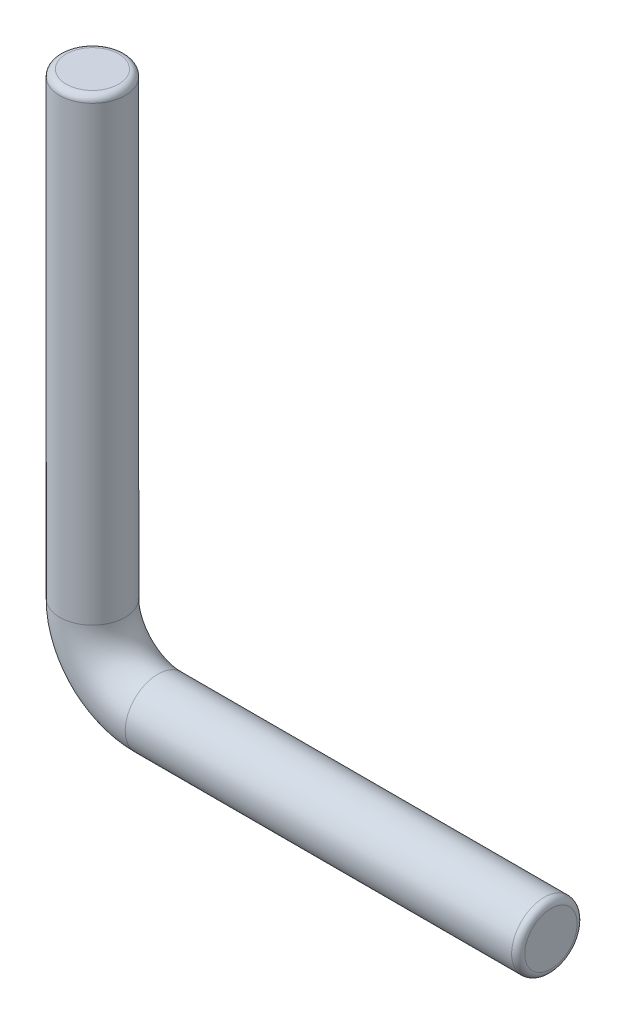
ISO-10303-21;
HEADER;
FILE_DESCRIPTION(('STEP AP214'),'2;1');
FILE_NAME('part.step','',(''),(''),'','','');
FILE_SCHEMA(('AUTOMOTIVE_DESIGN { 1 0 10303 214 1 1 1 1 }'));
ENDSEC;
DATA;
#1=APPLICATION_CONTEXT('core data for automotive mechanical design processes');
#2=APPLICATION_PROTOCOL_DEFINITION('international standard','automotive_design',2000,#1);
#3=PRODUCT_CONTEXT('',#1,'mechanical');
#4=PRODUCT('Part','Part','',(#3));
#5=PRODUCT_RELATED_PRODUCT_CATEGORY('part','',(#4));
#6=PRODUCT_DEFINITION_FORMATION('','',#4);
#7=PRODUCT_DEFINITION_CONTEXT('part definition',#1,'design');
#8=PRODUCT_DEFINITION('design','',#6,#7);
#9=PRODUCT_DEFINITION_SHAPE('','',#8);
#10=(LENGTH_UNIT() NAMED_UNIT(*) SI_UNIT(.MILLI.,.METRE.));
#11=(NAMED_UNIT(*) PLANE_ANGLE_UNIT() SI_UNIT($,.RADIAN.));
#12=(NAMED_UNIT(*) SI_UNIT($,.STERADIAN.) SOLID_ANGLE_UNIT());
#13=UNCERTAINTY_MEASURE_WITH_UNIT(LENGTH_MEASURE(1.E-05),#10,'distance_accuracy_value','');
#14=(GEOMETRIC_REPRESENTATION_CONTEXT(3) GLOBAL_UNCERTAINTY_ASSIGNED_CONTEXT((#13)) GLOBAL_UNIT_ASSIGNED_CONTEXT((#10,
#11,#12)) REPRESENTATION_CONTEXT('',''));
#15=CARTESIAN_POINT('',(0.,0.,0.));
#16=DIRECTION('',(0.,0.,1.));
#17=DIRECTION('',(1.,0.,0.));
#18=AXIS2_PLACEMENT_3D('',#15,#16,#17);
#19=CARTESIAN_POINT('',(70.,0.,0.));
#20=DIRECTION('',(1.,0.,0.));
#21=DIRECTION('',(0.,0.,-1.));
#22=AXIS2_PLACEMENT_3D('',#19,#20,#21);
#23=PLANE('',#22);
#24=CARTESIAN_POINT('',(70.,0.,0.));
#25=DIRECTION('',(1.,0.,0.));
#26=DIRECTION('',(0.,0.,-1.));
#27=AXIS2_PLACEMENT_3D('',#24,#25,#26);
#28=CIRCLE('',#27,4.);
#29=CARTESIAN_POINT('',(70.,0.,-4.));
#30=VERTEX_POINT('',#29);
#31=EDGE_CURVE('E62',#30,#30,#28,.T.);
#32=ORIENTED_EDGE('',*,*,#31,.T.);
#33=EDGE_LOOP('',(#32));
#34=FACE_BOUND('',#33,.T.);
#35=ADVANCED_FACE('F47',(#34),#23,.T.);
#36=CARTESIAN_POINT('',(0.,80.,0.));
#37=DIRECTION('',(0.,-1.,0.));
#38=DIRECTION('',(0.,0.,-1.));
#39=AXIS2_PLACEMENT_3D('',#36,#37,#38);
#40=PLANE('',#39);
#41=CARTESIAN_POINT('',(0.,80.,0.));
#42=DIRECTION('',(0.,-1.,0.));
#43=DIRECTION('',(0.,0.,-1.));
#44=AXIS2_PLACEMENT_3D('',#41,#42,#43);
#45=CIRCLE('',#44,4.);
#46=CARTESIAN_POINT('',(0.,80.,-4.));
#47=VERTEX_POINT('',#46);
#48=EDGE_CURVE('E11',#47,#47,#45,.F.);
#49=ORIENTED_EDGE('',*,*,#48,.T.);
#50=EDGE_LOOP('',(#49));
#51=FACE_BOUND('',#50,.T.);
#52=ADVANCED_FACE('F87',(#51),#40,.F.);
#53=CARTESIAN_POINT('',(70.,0.,0.));
#54=DIRECTION('',(-1.,0.,0.));
#55=DIRECTION('',(0.,0.,1.));
#56=AXIS2_PLACEMENT_3D('',#53,#54,#55);
#57=CYLINDRICAL_SURFACE('',#56,5.);
#58=CARTESIAN_POINT('',(69.,0.,0.));
#59=DIRECTION('',(1.,0.,0.));
#60=DIRECTION('',(0.,0.,-1.));
#61=AXIS2_PLACEMENT_3D('',#58,#59,#60);
#62=CIRCLE('',#61,5.);
#63=CARTESIAN_POINT('',(69.,0.,-5.));
#64=VERTEX_POINT('',#63);
#65=EDGE_CURVE('E58',#64,#64,#62,.F.);
#66=ORIENTED_EDGE('',*,*,#65,.T.);
#67=EDGE_LOOP('',(#66));
#68=FACE_BOUND('',#67,.T.);
#69=CARTESIAN_POINT('',(10.0000000000001,0.,0.));
#70=DIRECTION('',(1.,0.,0.));
#71=DIRECTION('',(0.,0.,-1.));
#72=AXIS2_PLACEMENT_3D('',#69,#70,#71);
#73=CIRCLE('',#72,5.);
#74=CARTESIAN_POINT('',(10.0000000000001,-5.,0.));
#75=VERTEX_POINT('',#74);
#76=EDGE_CURVE('E70',#75,#75,#73,.T.);
#77=ORIENTED_EDGE('',*,*,#76,.T.);
#78=EDGE_LOOP('',(#77));
#79=FACE_BOUND('',#78,.T.);
#80=ADVANCED_FACE('F74',(#68,#79),#57,.T.);
#81=CARTESIAN_POINT('',(10.,10.,0.));
#82=DIRECTION('',(0.,0.,-1.));
#83=DIRECTION('',(-1.,0.,0.));
#84=AXIS2_PLACEMENT_3D('',#81,#82,#83);
#85=TOROIDAL_SURFACE('',#84,10.,5.);
#86=CARTESIAN_POINT('',(0.,9.99999999999999,0.));
#87=DIRECTION('',(0.,-1.,0.));
#88=DIRECTION('',(0.,0.,-1.));
#89=AXIS2_PLACEMENT_3D('',#86,#87,#88);
#90=CIRCLE('',#89,5.);
#91=CARTESIAN_POINT('',(-5.,9.99999999999999,0.));
#92=VERTEX_POINT('',#91);
#93=EDGE_CURVE('E67',#92,#92,#90,.T.);
#94=CARTESIAN_POINT('',(10.,10.,0.));
#95=DIRECTION('',(0.,0.,-1.));
#96=DIRECTION('',(-1.,0.,0.));
#97=AXIS2_PLACEMENT_3D('',#94,#95,#96);
#98=CIRCLE('',#97,15.);
#99=EDGE_CURVE('',#75,#92,#98,.T.);
#100=ORIENTED_EDGE('',*,*,#76,.F.);
#101=ORIENTED_EDGE('',*,*,#93,.T.);
#102=ORIENTED_EDGE('',*,*,#99,.T.);
#103=ORIENTED_EDGE('',*,*,#99,.F.);
#104=EDGE_LOOP('',(#100,#102,#101,#103));
#105=FACE_BOUND('',#104,.T.);
#106=ADVANCED_FACE('F76',(#105),#85,.T.);
#107=CARTESIAN_POINT('',(0.,9.99999999999999,0.));
#108=DIRECTION('',(0.,1.,0.));
#109=DIRECTION('',(0.,0.,1.));
#110=AXIS2_PLACEMENT_3D('',#107,#108,#109);
#111=CYLINDRICAL_SURFACE('',#110,5.);
#112=CARTESIAN_POINT('',(0.,79.,0.));
#113=DIRECTION('',(0.,-1.,0.));
#114=DIRECTION('',(0.,0.,-1.));
#115=AXIS2_PLACEMENT_3D('',#112,#113,#114);
#116=CIRCLE('',#115,5.);
#117=CARTESIAN_POINT('',(0.,79.,-5.));
#118=VERTEX_POINT('',#117);
#119=EDGE_CURVE('E54',#118,#118,#116,.T.);
#120=ORIENTED_EDGE('',*,*,#119,.T.);
#121=EDGE_LOOP('',(#120));
#122=FACE_BOUND('',#121,.T.);
#123=ORIENTED_EDGE('',*,*,#93,.F.);
#124=EDGE_LOOP('',(#123));
#125=FACE_BOUND('',#124,.T.);
#126=ADVANCED_FACE('F78',(#122,#125),#111,.T.);
#127=CARTESIAN_POINT('',(69.,0.,0.));
#128=DIRECTION('',(1.,0.,0.));
#129=DIRECTION('',(0.,0.,-1.));
#130=AXIS2_PLACEMENT_3D('',#127,#128,#129);
#131=TOROIDAL_SURFACE('',#130,4.,1.);
#132=ORIENTED_EDGE('',*,*,#65,.F.);
#133=EDGE_LOOP('',(#132));
#134=FACE_BOUND('',#133,.T.);
#135=ORIENTED_EDGE('',*,*,#31,.F.);
#136=EDGE_LOOP('',(#135));
#137=FACE_BOUND('',#136,.T.);
#138=ADVANCED_FACE('F85',(#134,#137),#131,.T.);
#139=CARTESIAN_POINT('',(0.,79.,0.));
#140=DIRECTION('',(0.,-1.,0.));
#141=DIRECTION('',(0.,0.,-1.));
#142=AXIS2_PLACEMENT_3D('',#139,#140,#141);
#143=TOROIDAL_SURFACE('',#142,4.,1.);
#144=ORIENTED_EDGE('',*,*,#48,.F.);
#145=EDGE_LOOP('',(#144));
#146=FACE_BOUND('',#145,.T.);
#147=ORIENTED_EDGE('',*,*,#119,.F.);
#148=EDGE_LOOP('',(#147));
#149=FACE_BOUND('',#148,.T.);
#150=ADVANCED_FACE('F49',(#146,#149),#143,.T.);
#151=CLOSED_SHELL('',(#35,#52,#80,#106,#126,#138,#150));
#152=MANIFOLD_SOLID_BREP('B2',#151);
#153=ADVANCED_BREP_SHAPE_REPRESENTATION('',(#18,#152),#14);
#154=SHAPE_DEFINITION_REPRESENTATION(#9,#153);
ENDSEC;
END-ISO-10303-21;
